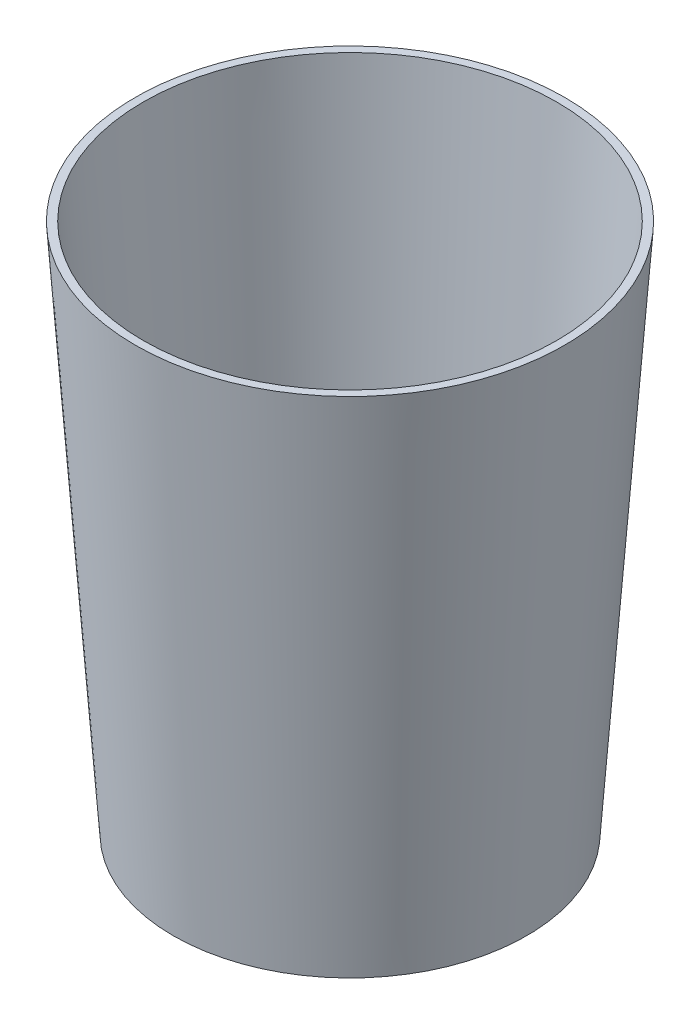
ISO-10303-21;
HEADER;
FILE_DESCRIPTION(('STEP AP214'),'2;1');
FILE_NAME('part.step','',(''),(''),'','','');
FILE_SCHEMA(('AUTOMOTIVE_DESIGN { 1 0 10303 214 1 1 1 1 }'));
ENDSEC;
DATA;
#1=APPLICATION_CONTEXT('core data for automotive mechanical design processes');
#2=APPLICATION_PROTOCOL_DEFINITION('international standard','automotive_design',2000,#1);
#3=PRODUCT_CONTEXT('',#1,'mechanical');
#4=PRODUCT('Part','Part','',(#3));
#5=PRODUCT_RELATED_PRODUCT_CATEGORY('part','',(#4));
#6=PRODUCT_DEFINITION_FORMATION('','',#4);
#7=PRODUCT_DEFINITION_CONTEXT('part definition',#1,'design');
#8=PRODUCT_DEFINITION('design','',#6,#7);
#9=PRODUCT_DEFINITION_SHAPE('','',#8);
#10=(LENGTH_UNIT() NAMED_UNIT(*) SI_UNIT(.MILLI.,.METRE.));
#11=(NAMED_UNIT(*) PLANE_ANGLE_UNIT() SI_UNIT($,.RADIAN.));
#12=(NAMED_UNIT(*) SI_UNIT($,.STERADIAN.) SOLID_ANGLE_UNIT());
#13=UNCERTAINTY_MEASURE_WITH_UNIT(LENGTH_MEASURE(1.E-05),#10,'distance_accuracy_value','');
#14=(GEOMETRIC_REPRESENTATION_CONTEXT(3) GLOBAL_UNCERTAINTY_ASSIGNED_CONTEXT((#13)) GLOBAL_UNIT_ASSIGNED_CONTEXT((#10,
#11,#12)) REPRESENTATION_CONTEXT('',''));
#15=CARTESIAN_POINT('',(0.,0.,0.));
#16=DIRECTION('',(0.,0.,1.));
#17=DIRECTION('',(1.,0.,0.));
#18=AXIS2_PLACEMENT_3D('',#15,#16,#17);
#19=CARTESIAN_POINT('',(88.9,0.,0.));
#20=DIRECTION('',(0.,-1.,0.));
#21=DIRECTION('',(0.,0.,-1.));
#22=AXIS2_PLACEMENT_3D('',#19,#20,#21);
#23=PLANE('',#22);
#24=CARTESIAN_POINT('',(0.,0.,0.));
#25=DIRECTION('',(0.,-1.,0.));
#26=DIRECTION('',(0.,0.,-1.));
#27=AXIS2_PLACEMENT_3D('',#24,#25,#26);
#28=CIRCLE('',#27,88.9);
#29=CARTESIAN_POINT('',(0.,0.,-88.9));
#30=VERTEX_POINT('',#29);
#31=EDGE_CURVE('E44',#30,#30,#28,.T.);
#32=ORIENTED_EDGE('',*,*,#31,.T.);
#33=EDGE_LOOP('',(#32));
#34=FACE_BOUND('',#33,.T.);
#35=ADVANCED_FACE('F37',(#34),#23,.T.);
#36=CARTESIAN_POINT('',(0.,266.7,0.));
#37=DIRECTION('',(0.,1.,0.));
#38=DIRECTION('',(0.,0.,1.));
#39=AXIS2_PLACEMENT_3D('',#36,#37,#38);
#40=PLANE('',#39);
#41=CARTESIAN_POINT('',(0.,266.7,0.));
#42=DIRECTION('',(0.,1.,0.));
#43=DIRECTION('',(0.,0.,1.));
#44=AXIS2_PLACEMENT_3D('',#41,#42,#43);
#45=CIRCLE('',#44,103.939808900681);
#46=CARTESIAN_POINT('',(0.,266.7,103.939808900681));
#47=VERTEX_POINT('',#46);
#48=EDGE_CURVE('E49',#47,#47,#45,.F.);
#49=ORIENTED_EDGE('',*,*,#48,.T.);
#50=EDGE_LOOP('',(#49));
#51=FACE_BOUND('',#50,.T.);
#52=CARTESIAN_POINT('',(0.,266.7,0.));
#53=DIRECTION('',(0.,-1.,0.));
#54=DIRECTION('',(0.,0.,-1.));
#55=AXIS2_PLACEMENT_3D('',#52,#53,#54);
#56=CIRCLE('',#55,107.95);
#57=CARTESIAN_POINT('',(0.,266.7,-107.95));
#58=VERTEX_POINT('',#57);
#59=EDGE_CURVE('E10',#58,#58,#56,.T.);
#60=ORIENTED_EDGE('',*,*,#59,.F.);
#61=EDGE_LOOP('',(#60));
#62=FACE_BOUND('',#61,.T.);
#63=ADVANCED_FACE('F73',(#51,#62),#40,.T.);
#64=CARTESIAN_POINT('',(0.,0.,0.));
#65=DIRECTION('',(0.,1.,0.));
#66=DIRECTION('',(0.,0.,1.));
#67=AXIS2_PLACEMENT_3D('',#64,#65,#66);
#68=CONICAL_SURFACE('',#67,88.9,0.0713074647852903);
#69=ORIENTED_EDGE('',*,*,#59,.T.);
#70=EDGE_LOOP('',(#69));
#71=FACE_BOUND('',#70,.T.);
#72=ORIENTED_EDGE('',*,*,#31,.F.);
#73=EDGE_LOOP('',(#72));
#74=FACE_BOUND('',#73,.T.);
#75=ADVANCED_FACE('F65',(#71,#74),#68,.T.);
#76=CARTESIAN_POINT('',(88.9,4.,0.));
#77=DIRECTION('',(0.,-1.,0.));
#78=DIRECTION('',(0.,0.,-1.));
#79=AXIS2_PLACEMENT_3D('',#76,#77,#78);
#80=PLANE('',#79);
#81=CARTESIAN_POINT('',(0.,4.,0.));
#82=DIRECTION('',(0.,-1.,0.));
#83=DIRECTION('',(0.,0.,-1.));
#84=AXIS2_PLACEMENT_3D('',#81,#82,#83);
#85=CIRCLE('',#84,85.1755231863948);
#86=CARTESIAN_POINT('',(0.,4.,-85.1755231863948));
#87=VERTEX_POINT('',#86);
#88=EDGE_CURVE('E54',#87,#87,#85,.T.);
#89=ORIENTED_EDGE('',*,*,#88,.F.);
#90=EDGE_LOOP('',(#89));
#91=FACE_BOUND('',#90,.T.);
#92=ADVANCED_FACE('F63',(#91),#80,.F.);
#93=CARTESIAN_POINT('',(0.,0.284988199951639,0.));
#94=DIRECTION('',(0.,1.,0.));
#95=DIRECTION('',(0.,0.,1.));
#96=AXIS2_PLACEMENT_3D('',#93,#94,#95);
#97=CONICAL_SURFACE('',#96,84.9101652006771,0.0713074647852903);
#98=ORIENTED_EDGE('',*,*,#48,.F.);
#99=EDGE_LOOP('',(#98));
#100=FACE_BOUND('',#99,.T.);
#101=ORIENTED_EDGE('',*,*,#88,.T.);
#102=EDGE_LOOP('',(#101));
#103=FACE_BOUND('',#102,.T.);
#104=ADVANCED_FACE('F61',(#100,#103),#97,.F.);
#105=CLOSED_SHELL('',(#35,#63,#75,#92,#104));
#106=MANIFOLD_SOLID_BREP('B2',#105);
#107=ADVANCED_BREP_SHAPE_REPRESENTATION('',(#18,#106),#14);
#108=SHAPE_DEFINITION_REPRESENTATION(#9,#107);
ENDSEC;
END-ISO-10303-21;
